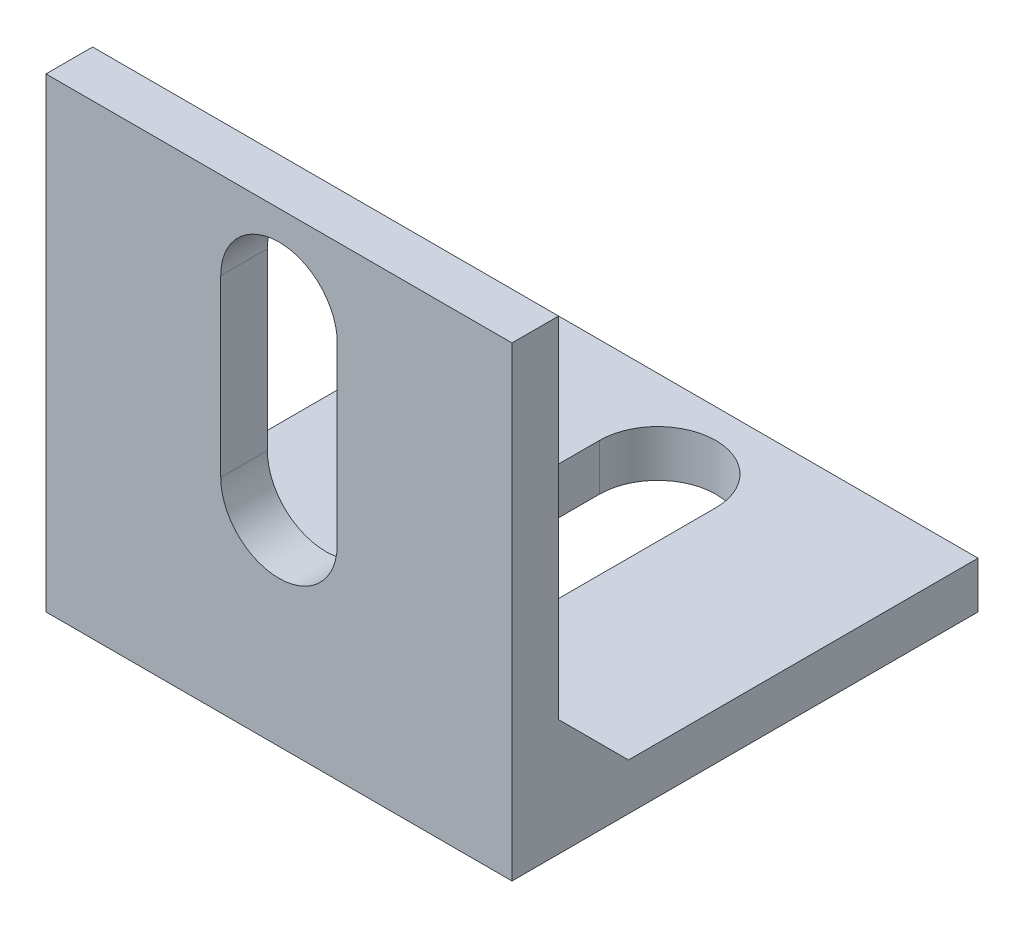
ISO-10303-21;
HEADER;
FILE_DESCRIPTION(('STEP AP214'),'2;1');
FILE_NAME('part.step','',(''),(''),'','','');
FILE_SCHEMA(('AUTOMOTIVE_DESIGN { 1 0 10303 214 1 1 1 1 }'));
ENDSEC;
DATA;
#1=APPLICATION_CONTEXT('core data for automotive mechanical design processes');
#2=APPLICATION_PROTOCOL_DEFINITION('international standard','automotive_design',2000,#1);
#3=PRODUCT_CONTEXT('',#1,'mechanical');
#4=PRODUCT('Part','Part','',(#3));
#5=PRODUCT_RELATED_PRODUCT_CATEGORY('part','',(#4));
#6=PRODUCT_DEFINITION_FORMATION('','',#4);
#7=PRODUCT_DEFINITION_CONTEXT('part definition',#1,'design');
#8=PRODUCT_DEFINITION('design','',#6,#7);
#9=PRODUCT_DEFINITION_SHAPE('','',#8);
#10=(LENGTH_UNIT() NAMED_UNIT(*) SI_UNIT(.MILLI.,.METRE.));
#11=(NAMED_UNIT(*) PLANE_ANGLE_UNIT() SI_UNIT($,.RADIAN.));
#12=(NAMED_UNIT(*) SI_UNIT($,.STERADIAN.) SOLID_ANGLE_UNIT());
#13=UNCERTAINTY_MEASURE_WITH_UNIT(LENGTH_MEASURE(1.E-05),#10,'distance_accuracy_value','');
#14=(GEOMETRIC_REPRESENTATION_CONTEXT(3) GLOBAL_UNCERTAINTY_ASSIGNED_CONTEXT((#13)) GLOBAL_UNIT_ASSIGNED_CONTEXT((#10,
#11,#12)) REPRESENTATION_CONTEXT('',''));
#15=CARTESIAN_POINT('',(0.,0.,0.));
#16=DIRECTION('',(0.,0.,1.));
#17=DIRECTION('',(1.,0.,0.));
#18=AXIS2_PLACEMENT_3D('',#15,#16,#17);
#19=CARTESIAN_POINT('',(10.,2.,-4.99999999999999));
#20=DIRECTION('',(0.,-1.,0.));
#21=DIRECTION('',(0.,0.,-1.));
#22=AXIS2_PLACEMENT_3D('',#19,#20,#21);
#23=PLANE('',#22);
#24=DIRECTION('',(0.,0.,1.));
#25=VECTOR('',#24,1.);
#26=CARTESIAN_POINT('',(-10.,2.,-4.99999999999999));
#27=LINE('',#26,#25);
#28=CARTESIAN_POINT('',(-10.,2.,-20.));
#29=VERTEX_POINT('',#28);
#30=CARTESIAN_POINT('',(-10.,2.,-4.99999999999999));
#31=VERTEX_POINT('',#30);
#32=EDGE_CURVE('E226',#29,#31,#27,.T.);
#33=ORIENTED_EDGE('',*,*,#32,.T.);
#34=DIRECTION('',(-1.,0.,0.));
#35=VECTOR('',#34,1.);
#36=CARTESIAN_POINT('',(10.,2.,-4.99999999999999));
#37=LINE('',#36,#35);
#38=CARTESIAN_POINT('',(10.,2.,-4.99999999999999));
#39=VERTEX_POINT('',#38);
#40=EDGE_CURVE('E41',#39,#31,#37,.T.);
#41=ORIENTED_EDGE('',*,*,#40,.F.);
#42=DIRECTION('',(0.,0.,1.));
#43=VECTOR('',#42,1.);
#44=CARTESIAN_POINT('',(10.,2.,-4.99999999999999));
#45=LINE('',#44,#43);
#46=CARTESIAN_POINT('',(10.,2.,-20.));
#47=VERTEX_POINT('',#46);
#48=EDGE_CURVE('E210',#47,#39,#45,.T.);
#49=ORIENTED_EDGE('',*,*,#48,.F.);
#50=DIRECTION('',(-1.,0.,0.));
#51=VECTOR('',#50,1.);
#52=CARTESIAN_POINT('',(10.,2.,-20.));
#53=LINE('',#52,#51);
#54=EDGE_CURVE('E11',#47,#29,#53,.T.);
#55=ORIENTED_EDGE('',*,*,#54,.T.);
#56=EDGE_LOOP('',(#33,#41,#49,#55));
#57=FACE_BOUND('',#56,.T.);
#58=CARTESIAN_POINT('',(0.,2.,-8.75));
#59=DIRECTION('',(0.,-1.,0.));
#60=DIRECTION('',(0.,0.,-1.));
#61=AXIS2_PLACEMENT_3D('',#58,#59,#60);
#62=CIRCLE('',#61,2.5);
#63=CARTESIAN_POINT('',(2.5,2.,-8.75));
#64=VERTEX_POINT('',#63);
#65=CARTESIAN_POINT('',(-2.5,2.,-8.75));
#66=VERTEX_POINT('',#65);
#67=EDGE_CURVE('E48',#64,#66,#62,.T.);
#68=ORIENTED_EDGE('',*,*,#67,.T.);
#69=DIRECTION('',(0.,0.,-1.));
#70=VECTOR('',#69,1.);
#71=CARTESIAN_POINT('',(-2.5,2.,-8.75));
#72=LINE('',#71,#70);
#73=CARTESIAN_POINT('',(-2.5,2.,-16.25));
#74=VERTEX_POINT('',#73);
#75=EDGE_CURVE('E156',#66,#74,#72,.T.);
#76=ORIENTED_EDGE('',*,*,#75,.T.);
#77=CARTESIAN_POINT('',(0.,2.,-16.25));
#78=DIRECTION('',(0.,-1.,0.));
#79=DIRECTION('',(0.,0.,-1.));
#80=AXIS2_PLACEMENT_3D('',#77,#78,#79);
#81=CIRCLE('',#80,2.5);
#82=CARTESIAN_POINT('',(2.5,2.,-16.25));
#83=VERTEX_POINT('',#82);
#84=EDGE_CURVE('E159',#74,#83,#81,.T.);
#85=ORIENTED_EDGE('',*,*,#84,.T.);
#86=DIRECTION('',(0.,0.,1.));
#87=VECTOR('',#86,1.);
#88=CARTESIAN_POINT('',(2.5,2.,-8.75));
#89=LINE('',#88,#87);
#90=EDGE_CURVE('E165',#83,#64,#89,.T.);
#91=ORIENTED_EDGE('',*,*,#90,.T.);
#92=EDGE_LOOP('',(#68,#76,#85,#91));
#93=FACE_BOUND('',#92,.T.);
#94=ADVANCED_FACE('F33',(#57,#93),#23,.F.);
#95=CARTESIAN_POINT('',(10.,0.,-20.));
#96=DIRECTION('',(0.,1.,0.));
#97=DIRECTION('',(0.,0.,1.));
#98=AXIS2_PLACEMENT_3D('',#95,#96,#97);
#99=PLANE('',#98);
#100=DIRECTION('',(0.,0.,-1.));
#101=VECTOR('',#100,1.);
#102=CARTESIAN_POINT('',(-10.,0.,-20.));
#103=LINE('',#102,#101);
#104=CARTESIAN_POINT('',(-10.,0.,0.));
#105=VERTEX_POINT('',#104);
#106=CARTESIAN_POINT('',(-10.,0.,-20.));
#107=VERTEX_POINT('',#106);
#108=EDGE_CURVE('E211',#105,#107,#103,.T.);
#109=ORIENTED_EDGE('',*,*,#108,.T.);
#110=DIRECTION('',(-1.,0.,0.));
#111=VECTOR('',#110,1.);
#112=CARTESIAN_POINT('',(10.,0.,-20.));
#113=LINE('',#112,#111);
#114=CARTESIAN_POINT('',(10.,0.,-20.));
#115=VERTEX_POINT('',#114);
#116=EDGE_CURVE('E223',#115,#107,#113,.T.);
#117=ORIENTED_EDGE('',*,*,#116,.F.);
#118=DIRECTION('',(0.,0.,-1.));
#119=VECTOR('',#118,1.);
#120=CARTESIAN_POINT('',(10.,0.,-20.));
#121=LINE('',#120,#119);
#122=CARTESIAN_POINT('',(10.,0.,0.));
#123=VERTEX_POINT('',#122);
#124=EDGE_CURVE('E221',#123,#115,#121,.T.);
#125=ORIENTED_EDGE('',*,*,#124,.F.);
#126=DIRECTION('',(-1.,0.,0.));
#127=VECTOR('',#126,1.);
#128=CARTESIAN_POINT('',(10.,0.,0.));
#129=LINE('',#128,#127);
#130=EDGE_CURVE('E239',#123,#105,#129,.T.);
#131=ORIENTED_EDGE('',*,*,#130,.T.);
#132=EDGE_LOOP('',(#109,#117,#125,#131));
#133=FACE_BOUND('',#132,.T.);
#134=CARTESIAN_POINT('',(0.,0.,-8.75));
#135=DIRECTION('',(0.,-1.,0.));
#136=DIRECTION('',(0.,0.,-1.));
#137=AXIS2_PLACEMENT_3D('',#134,#135,#136);
#138=CIRCLE('',#137,2.5);
#139=CARTESIAN_POINT('',(2.5,0.,-8.75));
#140=VERTEX_POINT('',#139);
#141=CARTESIAN_POINT('',(-2.5,0.,-8.75));
#142=VERTEX_POINT('',#141);
#143=EDGE_CURVE('E148',#140,#142,#138,.T.);
#144=ORIENTED_EDGE('',*,*,#143,.F.);
#145=DIRECTION('',(0.,0.,1.));
#146=VECTOR('',#145,1.);
#147=CARTESIAN_POINT('',(2.5,0.,-8.75));
#148=LINE('',#147,#146);
#149=CARTESIAN_POINT('',(2.5,0.,-16.25));
#150=VERTEX_POINT('',#149);
#151=EDGE_CURVE('E140',#150,#140,#148,.T.);
#152=ORIENTED_EDGE('',*,*,#151,.F.);
#153=CARTESIAN_POINT('',(0.,0.,-16.25));
#154=DIRECTION('',(0.,-1.,0.));
#155=DIRECTION('',(0.,0.,-1.));
#156=AXIS2_PLACEMENT_3D('',#153,#154,#155);
#157=CIRCLE('',#156,2.5);
#158=CARTESIAN_POINT('',(-2.5,0.,-16.25));
#159=VERTEX_POINT('',#158);
#160=EDGE_CURVE('E147',#159,#150,#157,.T.);
#161=ORIENTED_EDGE('',*,*,#160,.F.);
#162=DIRECTION('',(0.,0.,-1.));
#163=VECTOR('',#162,1.);
#164=CARTESIAN_POINT('',(-2.5,0.,-8.75));
#165=LINE('',#164,#163);
#166=EDGE_CURVE('E152',#142,#159,#165,.T.);
#167=ORIENTED_EDGE('',*,*,#166,.F.);
#168=EDGE_LOOP('',(#144,#152,#161,#167));
#169=FACE_BOUND('',#168,.T.);
#170=ADVANCED_FACE('F155',(#133,#169),#99,.F.);
#171=CARTESIAN_POINT('',(10.,2.,-20.));
#172=DIRECTION('',(0.,0.,1.));
#173=DIRECTION('',(0.,-1.,0.));
#174=AXIS2_PLACEMENT_3D('',#171,#172,#173);
#175=PLANE('',#174);
#176=DIRECTION('',(0.,1.,0.));
#177=VECTOR('',#176,1.);
#178=CARTESIAN_POINT('',(-10.,2.,-20.));
#179=LINE('',#178,#177);
#180=EDGE_CURVE('E200',#107,#29,#179,.T.);
#181=ORIENTED_EDGE('',*,*,#180,.T.);
#182=ORIENTED_EDGE('',*,*,#54,.F.);
#183=DIRECTION('',(0.,1.,0.));
#184=VECTOR('',#183,1.);
#185=CARTESIAN_POINT('',(10.,2.,-20.));
#186=LINE('',#185,#184);
#187=EDGE_CURVE('E207',#115,#47,#186,.T.);
#188=ORIENTED_EDGE('',*,*,#187,.F.);
#189=ORIENTED_EDGE('',*,*,#116,.T.);
#190=EDGE_LOOP('',(#181,#182,#188,#189));
#191=FACE_BOUND('',#190,.T.);
#192=ADVANCED_FACE('F35',(#191),#175,.F.);
#193=CARTESIAN_POINT('',(10.,4.99999999999999,-2.));
#194=DIRECTION('',(0.,-0.707106781186547,0.707106781186548));
#195=DIRECTION('',(0.,-0.707106781186548,-0.707106781186547));
#196=AXIS2_PLACEMENT_3D('',#193,#194,#195);
#197=PLANE('',#196);
#198=DIRECTION('',(0.,0.707106781186548,0.707106781186547));
#199=VECTOR('',#198,1.);
#200=CARTESIAN_POINT('',(-10.,4.99999999999999,-2.));
#201=LINE('',#200,#199);
#202=CARTESIAN_POINT('',(-10.,4.99999999999999,-2.));
#203=VERTEX_POINT('',#202);
#204=EDGE_CURVE('E228',#31,#203,#201,.T.);
#205=ORIENTED_EDGE('',*,*,#204,.T.);
#206=DIRECTION('',(-1.,0.,0.));
#207=VECTOR('',#206,1.);
#208=CARTESIAN_POINT('',(10.,4.99999999999999,-2.));
#209=LINE('',#208,#207);
#210=CARTESIAN_POINT('',(10.,4.99999999999999,-2.));
#211=VERTEX_POINT('',#210);
#212=EDGE_CURVE('E248',#211,#203,#209,.T.);
#213=ORIENTED_EDGE('',*,*,#212,.F.);
#214=DIRECTION('',(0.,0.707106781186548,0.707106781186547));
#215=VECTOR('',#214,1.);
#216=CARTESIAN_POINT('',(10.,4.99999999999999,-2.));
#217=LINE('',#216,#215);
#218=EDGE_CURVE('E213',#39,#211,#217,.T.);
#219=ORIENTED_EDGE('',*,*,#218,.F.);
#220=ORIENTED_EDGE('',*,*,#40,.T.);
#221=EDGE_LOOP('',(#205,#213,#219,#220));
#222=FACE_BOUND('',#221,.T.);
#223=ADVANCED_FACE('F255',(#222),#197,.F.);
#224=CARTESIAN_POINT('',(10.,20.,-2.));
#225=DIRECTION('',(0.,0.,1.));
#226=DIRECTION('',(0.,-1.,0.));
#227=AXIS2_PLACEMENT_3D('',#224,#225,#226);
#228=PLANE('',#227);
#229=DIRECTION('',(0.,1.,0.));
#230=VECTOR('',#229,1.);
#231=CARTESIAN_POINT('',(-2.5,8.75,-2.));
#232=LINE('',#231,#230);
#233=CARTESIAN_POINT('',(-2.5,8.75,-2.));
#234=VERTEX_POINT('',#233);
#235=CARTESIAN_POINT('',(-2.5,16.25,-2.));
#236=VERTEX_POINT('',#235);
#237=EDGE_CURVE('E190',#234,#236,#232,.T.);
#238=ORIENTED_EDGE('',*,*,#237,.F.);
#239=CARTESIAN_POINT('',(0.,8.75,-2.));
#240=DIRECTION('',(0.,0.,-1.));
#241=DIRECTION('',(0.,1.,0.));
#242=AXIS2_PLACEMENT_3D('',#239,#240,#241);
#243=CIRCLE('',#242,2.5);
#244=CARTESIAN_POINT('',(2.5,8.75,-2.));
#245=VERTEX_POINT('',#244);
#246=EDGE_CURVE('E171',#245,#234,#243,.T.);
#247=ORIENTED_EDGE('',*,*,#246,.F.);
#248=DIRECTION('',(0.,-1.,0.));
#249=VECTOR('',#248,1.);
#250=CARTESIAN_POINT('',(2.5,8.75,-2.));
#251=LINE('',#250,#249);
#252=CARTESIAN_POINT('',(2.5,16.25,-2.));
#253=VERTEX_POINT('',#252);
#254=EDGE_CURVE('E179',#253,#245,#251,.T.);
#255=ORIENTED_EDGE('',*,*,#254,.F.);
#256=CARTESIAN_POINT('',(0.,16.25,-2.));
#257=DIRECTION('',(0.,0.,-1.));
#258=DIRECTION('',(0.,1.,0.));
#259=AXIS2_PLACEMENT_3D('',#256,#257,#258);
#260=CIRCLE('',#259,2.5);
#261=EDGE_CURVE('E193',#236,#253,#260,.T.);
#262=ORIENTED_EDGE('',*,*,#261,.F.);
#263=EDGE_LOOP('',(#238,#247,#255,#262));
#264=FACE_BOUND('',#263,.T.);
#265=DIRECTION('',(0.,1.,0.));
#266=VECTOR('',#265,1.);
#267=CARTESIAN_POINT('',(-10.,20.,-2.));
#268=LINE('',#267,#266);
#269=CARTESIAN_POINT('',(-10.,20.,-2.));
#270=VERTEX_POINT('',#269);
#271=EDGE_CURVE('E230',#203,#270,#268,.T.);
#272=ORIENTED_EDGE('',*,*,#271,.T.);
#273=DIRECTION('',(-1.,0.,0.));
#274=VECTOR('',#273,1.);
#275=CARTESIAN_POINT('',(10.,20.,-2.));
#276=LINE('',#275,#274);
#277=CARTESIAN_POINT('',(10.,20.,-2.));
#278=VERTEX_POINT('',#277);
#279=EDGE_CURVE('E245',#278,#270,#276,.T.);
#280=ORIENTED_EDGE('',*,*,#279,.F.);
#281=DIRECTION('',(0.,1.,0.));
#282=VECTOR('',#281,1.);
#283=CARTESIAN_POINT('',(10.,20.,-2.));
#284=LINE('',#283,#282);
#285=EDGE_CURVE('E215',#211,#278,#284,.T.);
#286=ORIENTED_EDGE('',*,*,#285,.F.);
#287=ORIENTED_EDGE('',*,*,#212,.T.);
#288=EDGE_LOOP('',(#272,#280,#286,#287));
#289=FACE_BOUND('',#288,.T.);
#290=ADVANCED_FACE('F266',(#264,#289),#228,.F.);
#291=CARTESIAN_POINT('',(10.,20.,0.));
#292=DIRECTION('',(0.,-1.,0.));
#293=DIRECTION('',(0.,0.,-1.));
#294=AXIS2_PLACEMENT_3D('',#291,#292,#293);
#295=PLANE('',#294);
#296=DIRECTION('',(0.,0.,1.));
#297=VECTOR('',#296,1.);
#298=CARTESIAN_POINT('',(-10.,20.,0.));
#299=LINE('',#298,#297);
#300=CARTESIAN_POINT('',(-10.,20.,0.));
#301=VERTEX_POINT('',#300);
#302=EDGE_CURVE('E232',#270,#301,#299,.T.);
#303=ORIENTED_EDGE('',*,*,#302,.T.);
#304=DIRECTION('',(-1.,0.,0.));
#305=VECTOR('',#304,1.);
#306=CARTESIAN_POINT('',(10.,20.,0.));
#307=LINE('',#306,#305);
#308=CARTESIAN_POINT('',(10.,20.,0.));
#309=VERTEX_POINT('',#308);
#310=EDGE_CURVE('E242',#309,#301,#307,.T.);
#311=ORIENTED_EDGE('',*,*,#310,.F.);
#312=DIRECTION('',(0.,0.,1.));
#313=VECTOR('',#312,1.);
#314=CARTESIAN_POINT('',(10.,20.,0.));
#315=LINE('',#314,#313);
#316=EDGE_CURVE('E217',#278,#309,#315,.T.);
#317=ORIENTED_EDGE('',*,*,#316,.F.);
#318=ORIENTED_EDGE('',*,*,#279,.T.);
#319=EDGE_LOOP('',(#303,#311,#317,#318));
#320=FACE_BOUND('',#319,.T.);
#321=ADVANCED_FACE('F270',(#320),#295,.F.);
#322=CARTESIAN_POINT('',(10.,0.,0.));
#323=DIRECTION('',(0.,0.,-1.));
#324=DIRECTION('',(-1.,0.,0.));
#325=AXIS2_PLACEMENT_3D('',#322,#323,#324);
#326=PLANE('',#325);
#327=DIRECTION('',(0.,-1.,0.));
#328=VECTOR('',#327,1.);
#329=CARTESIAN_POINT('',(2.5,8.75,0.));
#330=LINE('',#329,#328);
#331=CARTESIAN_POINT('',(2.5,16.25,0.));
#332=VERTEX_POINT('',#331);
#333=CARTESIAN_POINT('',(2.5,8.75,0.));
#334=VERTEX_POINT('',#333);
#335=EDGE_CURVE('E185',#332,#334,#330,.T.);
#336=ORIENTED_EDGE('',*,*,#335,.T.);
#337=CARTESIAN_POINT('',(0.,8.75,0.));
#338=DIRECTION('',(0.,0.,-1.));
#339=DIRECTION('',(0.,1.,0.));
#340=AXIS2_PLACEMENT_3D('',#337,#338,#339);
#341=CIRCLE('',#340,2.5);
#342=CARTESIAN_POINT('',(-2.5,8.75,0.));
#343=VERTEX_POINT('',#342);
#344=EDGE_CURVE('E175',#334,#343,#341,.T.);
#345=ORIENTED_EDGE('',*,*,#344,.T.);
#346=DIRECTION('',(0.,1.,0.));
#347=VECTOR('',#346,1.);
#348=CARTESIAN_POINT('',(-2.5,8.75,0.));
#349=LINE('',#348,#347);
#350=CARTESIAN_POINT('',(-2.5,16.25,0.));
#351=VERTEX_POINT('',#350);
#352=EDGE_CURVE('E178',#343,#351,#349,.T.);
#353=ORIENTED_EDGE('',*,*,#352,.T.);
#354=CARTESIAN_POINT('',(0.,16.25,0.));
#355=DIRECTION('',(0.,0.,-1.));
#356=DIRECTION('',(0.,1.,0.));
#357=AXIS2_PLACEMENT_3D('',#354,#355,#356);
#358=CIRCLE('',#357,2.5);
#359=EDGE_CURVE('E182',#351,#332,#358,.T.);
#360=ORIENTED_EDGE('',*,*,#359,.T.);
#361=EDGE_LOOP('',(#336,#345,#353,#360));
#362=FACE_BOUND('',#361,.T.);
#363=DIRECTION('',(0.,-1.,0.));
#364=VECTOR('',#363,1.);
#365=CARTESIAN_POINT('',(-10.,0.,0.));
#366=LINE('',#365,#364);
#367=EDGE_CURVE('E234',#301,#105,#366,.T.);
#368=ORIENTED_EDGE('',*,*,#367,.T.);
#369=ORIENTED_EDGE('',*,*,#130,.F.);
#370=DIRECTION('',(0.,-1.,0.));
#371=VECTOR('',#370,1.);
#372=CARTESIAN_POINT('',(10.,0.,0.));
#373=LINE('',#372,#371);
#374=EDGE_CURVE('E219',#309,#123,#373,.T.);
#375=ORIENTED_EDGE('',*,*,#374,.F.);
#376=ORIENTED_EDGE('',*,*,#310,.T.);
#377=EDGE_LOOP('',(#368,#369,#375,#376));
#378=FACE_BOUND('',#377,.T.);
#379=ADVANCED_FACE('F285',(#362,#378),#326,.F.);
#380=CARTESIAN_POINT('',(10.,0.,0.));
#381=DIRECTION('',(-1.,0.,0.));
#382=DIRECTION('',(0.,0.,1.));
#383=AXIS2_PLACEMENT_3D('',#380,#381,#382);
#384=PLANE('',#383);
#385=ORIENTED_EDGE('',*,*,#187,.T.);
#386=ORIENTED_EDGE('',*,*,#48,.T.);
#387=ORIENTED_EDGE('',*,*,#218,.T.);
#388=ORIENTED_EDGE('',*,*,#285,.T.);
#389=ORIENTED_EDGE('',*,*,#316,.T.);
#390=ORIENTED_EDGE('',*,*,#374,.T.);
#391=ORIENTED_EDGE('',*,*,#124,.T.);
#392=EDGE_LOOP('',(#385,#386,#387,#388,#389,#390,#391));
#393=FACE_BOUND('',#392,.T.);
#394=ADVANCED_FACE('F274',(#393),#384,.F.);
#395=CARTESIAN_POINT('',(-10.,0.,0.));
#396=DIRECTION('',(-1.,0.,0.));
#397=DIRECTION('',(0.,0.,1.));
#398=AXIS2_PLACEMENT_3D('',#395,#396,#397);
#399=PLANE('',#398);
#400=ORIENTED_EDGE('',*,*,#180,.F.);
#401=ORIENTED_EDGE('',*,*,#108,.F.);
#402=ORIENTED_EDGE('',*,*,#367,.F.);
#403=ORIENTED_EDGE('',*,*,#302,.F.);
#404=ORIENTED_EDGE('',*,*,#271,.F.);
#405=ORIENTED_EDGE('',*,*,#204,.F.);
#406=ORIENTED_EDGE('',*,*,#32,.F.);
#407=EDGE_LOOP('',(#400,#401,#402,#403,#404,#405,#406));
#408=FACE_BOUND('',#407,.T.);
#409=ADVANCED_FACE('F261',(#408),#399,.T.);
#410=CARTESIAN_POINT('',(0.,8.75,0.));
#411=DIRECTION('',(0.,0.,-1.));
#412=DIRECTION('',(0.,1.,0.));
#413=AXIS2_PLACEMENT_3D('',#410,#411,#412);
#414=CYLINDRICAL_SURFACE('',#413,2.5);
#415=ORIENTED_EDGE('',*,*,#246,.T.);
#416=DIRECTION('',(0.,0.,-1.));
#417=VECTOR('',#416,1.);
#418=CARTESIAN_POINT('',(-2.5,8.75,0.));
#419=LINE('',#418,#417);
#420=EDGE_CURVE('E188',#343,#234,#419,.T.);
#421=ORIENTED_EDGE('',*,*,#420,.F.);
#422=ORIENTED_EDGE('',*,*,#344,.F.);
#423=DIRECTION('',(0.,0.,-1.));
#424=VECTOR('',#423,1.);
#425=CARTESIAN_POINT('',(2.5,8.75,0.));
#426=LINE('',#425,#424);
#427=EDGE_CURVE('E198',#334,#245,#426,.T.);
#428=ORIENTED_EDGE('',*,*,#427,.T.);
#429=EDGE_LOOP('',(#415,#421,#422,#428));
#430=FACE_BOUND('',#429,.T.);
#431=ADVANCED_FACE('F317',(#430),#414,.F.);
#432=CARTESIAN_POINT('',(2.5,8.75,0.));
#433=DIRECTION('',(1.,0.,0.));
#434=DIRECTION('',(0.,1.,0.));
#435=AXIS2_PLACEMENT_3D('',#432,#433,#434);
#436=PLANE('',#435);
#437=ORIENTED_EDGE('',*,*,#254,.T.);
#438=ORIENTED_EDGE('',*,*,#427,.F.);
#439=ORIENTED_EDGE('',*,*,#335,.F.);
#440=DIRECTION('',(0.,0.,-1.));
#441=VECTOR('',#440,1.);
#442=CARTESIAN_POINT('',(2.5,16.25,0.));
#443=LINE('',#442,#441);
#444=EDGE_CURVE('E201',#332,#253,#443,.T.);
#445=ORIENTED_EDGE('',*,*,#444,.T.);
#446=EDGE_LOOP('',(#437,#438,#439,#445));
#447=FACE_BOUND('',#446,.T.);
#448=ADVANCED_FACE('F320',(#447),#436,.F.);
#449=CARTESIAN_POINT('',(0.,16.25,0.));
#450=DIRECTION('',(0.,0.,-1.));
#451=DIRECTION('',(0.,1.,0.));
#452=AXIS2_PLACEMENT_3D('',#449,#450,#451);
#453=CYLINDRICAL_SURFACE('',#452,2.5);
#454=ORIENTED_EDGE('',*,*,#261,.T.);
#455=ORIENTED_EDGE('',*,*,#444,.F.);
#456=ORIENTED_EDGE('',*,*,#359,.F.);
#457=DIRECTION('',(0.,0.,-1.));
#458=VECTOR('',#457,1.);
#459=CARTESIAN_POINT('',(-2.5,16.25,0.));
#460=LINE('',#459,#458);
#461=EDGE_CURVE('E203',#351,#236,#460,.T.);
#462=ORIENTED_EDGE('',*,*,#461,.T.);
#463=EDGE_LOOP('',(#454,#455,#456,#462));
#464=FACE_BOUND('',#463,.T.);
#465=ADVANCED_FACE('F322',(#464),#453,.F.);
#466=CARTESIAN_POINT('',(-2.5,8.75,0.));
#467=DIRECTION('',(-1.,0.,0.));
#468=DIRECTION('',(0.,-1.,0.));
#469=AXIS2_PLACEMENT_3D('',#466,#467,#468);
#470=PLANE('',#469);
#471=ORIENTED_EDGE('',*,*,#237,.T.);
#472=ORIENTED_EDGE('',*,*,#461,.F.);
#473=ORIENTED_EDGE('',*,*,#352,.F.);
#474=ORIENTED_EDGE('',*,*,#420,.T.);
#475=EDGE_LOOP('',(#471,#472,#473,#474));
#476=FACE_BOUND('',#475,.T.);
#477=ADVANCED_FACE('F313',(#476),#470,.F.);
#478=CARTESIAN_POINT('',(0.,0.,-8.75));
#479=DIRECTION('',(0.,1.,0.));
#480=DIRECTION('',(0.,0.,1.));
#481=AXIS2_PLACEMENT_3D('',#478,#479,#480);
#482=CYLINDRICAL_SURFACE('',#481,2.5);
#483=ORIENTED_EDGE('',*,*,#67,.F.);
#484=DIRECTION('',(0.,1.,0.));
#485=VECTOR('',#484,1.);
#486=CARTESIAN_POINT('',(2.5,0.,-8.75));
#487=LINE('',#486,#485);
#488=EDGE_CURVE('E142',#140,#64,#487,.T.);
#489=ORIENTED_EDGE('',*,*,#488,.F.);
#490=ORIENTED_EDGE('',*,*,#143,.T.);
#491=DIRECTION('',(0.,1.,0.));
#492=VECTOR('',#491,1.);
#493=CARTESIAN_POINT('',(-2.5,0.,-8.75));
#494=LINE('',#493,#492);
#495=EDGE_CURVE('E169',#142,#66,#494,.T.);
#496=ORIENTED_EDGE('',*,*,#495,.T.);
#497=EDGE_LOOP('',(#483,#489,#490,#496));
#498=FACE_BOUND('',#497,.T.);
#499=ADVANCED_FACE('F150',(#498),#482,.F.);
#500=CARTESIAN_POINT('',(-2.5,0.,-8.75));
#501=DIRECTION('',(1.,0.,0.));
#502=DIRECTION('',(0.,0.,-1.));
#503=AXIS2_PLACEMENT_3D('',#500,#501,#502);
#504=PLANE('',#503);
#505=ORIENTED_EDGE('',*,*,#75,.F.);
#506=ORIENTED_EDGE('',*,*,#495,.F.);
#507=ORIENTED_EDGE('',*,*,#166,.T.);
#508=DIRECTION('',(0.,1.,0.));
#509=VECTOR('',#508,1.);
#510=CARTESIAN_POINT('',(-2.5,0.,-16.25));
#511=LINE('',#510,#509);
#512=EDGE_CURVE('E172',#159,#74,#511,.T.);
#513=ORIENTED_EDGE('',*,*,#512,.T.);
#514=EDGE_LOOP('',(#505,#506,#507,#513));
#515=FACE_BOUND('',#514,.T.);
#516=ADVANCED_FACE('F378',(#515),#504,.T.);
#517=CARTESIAN_POINT('',(0.,0.,-16.25));
#518=DIRECTION('',(0.,1.,0.));
#519=DIRECTION('',(0.,0.,1.));
#520=AXIS2_PLACEMENT_3D('',#517,#518,#519);
#521=CYLINDRICAL_SURFACE('',#520,2.5);
#522=ORIENTED_EDGE('',*,*,#84,.F.);
#523=ORIENTED_EDGE('',*,*,#512,.F.);
#524=ORIENTED_EDGE('',*,*,#160,.T.);
#525=DIRECTION('',(0.,1.,0.));
#526=VECTOR('',#525,1.);
#527=CARTESIAN_POINT('',(2.5,0.,-16.25));
#528=LINE('',#527,#526);
#529=EDGE_CURVE('E56',#150,#83,#528,.T.);
#530=ORIENTED_EDGE('',*,*,#529,.T.);
#531=EDGE_LOOP('',(#522,#523,#524,#530));
#532=FACE_BOUND('',#531,.T.);
#533=ADVANCED_FACE('F386',(#532),#521,.F.);
#534=CARTESIAN_POINT('',(2.5,0.,-8.75));
#535=DIRECTION('',(-1.,0.,0.));
#536=DIRECTION('',(0.,0.,1.));
#537=AXIS2_PLACEMENT_3D('',#534,#535,#536);
#538=PLANE('',#537);
#539=ORIENTED_EDGE('',*,*,#90,.F.);
#540=ORIENTED_EDGE('',*,*,#529,.F.);
#541=ORIENTED_EDGE('',*,*,#151,.T.);
#542=ORIENTED_EDGE('',*,*,#488,.T.);
#543=EDGE_LOOP('',(#539,#540,#541,#542));
#544=FACE_BOUND('',#543,.T.);
#545=ADVANCED_FACE('F141',(#544),#538,.T.);
#546=CLOSED_SHELL('',(#94,#170,#192,#223,#290,#321,#379,#394,#409,#431,#448,#465,#477,#499,#516,
#533,#545));
#547=MANIFOLD_SOLID_BREP('B2',#546);
#548=ADVANCED_BREP_SHAPE_REPRESENTATION('',(#18,#547),#14);
#549=SHAPE_DEFINITION_REPRESENTATION(#9,#548);
ENDSEC;
END-ISO-10303-21;
